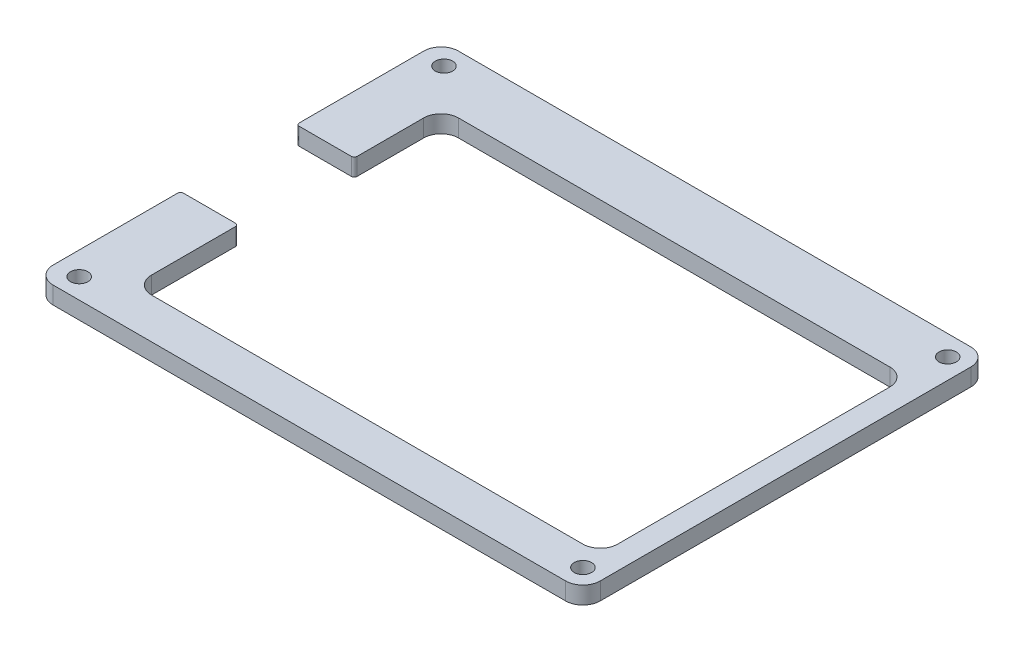
ISO-10303-21;
HEADER;
FILE_DESCRIPTION(('STEP AP214'),'2;1');
FILE_NAME('part.step','',(''),(''),'','','');
FILE_SCHEMA(('AUTOMOTIVE_DESIGN { 1 0 10303 214 1 1 1 1 }'));
ENDSEC;
DATA;
#1=APPLICATION_CONTEXT('core data for automotive mechanical design processes');
#2=APPLICATION_PROTOCOL_DEFINITION('international standard','automotive_design',2000,#1);
#3=PRODUCT_CONTEXT('',#1,'mechanical');
#4=PRODUCT('Part','Part','',(#3));
#5=PRODUCT_RELATED_PRODUCT_CATEGORY('part','',(#4));
#6=PRODUCT_DEFINITION_FORMATION('','',#4);
#7=PRODUCT_DEFINITION_CONTEXT('part definition',#1,'design');
#8=PRODUCT_DEFINITION('design','',#6,#7);
#9=PRODUCT_DEFINITION_SHAPE('','',#8);
#10=(LENGTH_UNIT() NAMED_UNIT(*) SI_UNIT(.MILLI.,.METRE.));
#11=(NAMED_UNIT(*) PLANE_ANGLE_UNIT() SI_UNIT($,.RADIAN.));
#12=(NAMED_UNIT(*) SI_UNIT($,.STERADIAN.) SOLID_ANGLE_UNIT());
#13=UNCERTAINTY_MEASURE_WITH_UNIT(LENGTH_MEASURE(1.E-05),#10,'distance_accuracy_value','');
#14=(GEOMETRIC_REPRESENTATION_CONTEXT(3) GLOBAL_UNCERTAINTY_ASSIGNED_CONTEXT((#13)) GLOBAL_UNIT_ASSIGNED_CONTEXT((#10,
#11,#12)) REPRESENTATION_CONTEXT('',''));
#15=CARTESIAN_POINT('',(0.,0.,0.));
#16=DIRECTION('',(0.,0.,1.));
#17=DIRECTION('',(1.,0.,0.));
#18=AXIS2_PLACEMENT_3D('',#15,#16,#17);
#19=CARTESIAN_POINT('',(-47.25,3.,-35.));
#20=DIRECTION('',(1.,0.,0.));
#21=DIRECTION('',(0.,0.,-1.));
#22=AXIS2_PLACEMENT_3D('',#19,#20,#21);
#23=PLANE('',#22);
#24=DIRECTION('',(0.,0.,1.));
#25=VECTOR('',#24,1.);
#26=CARTESIAN_POINT('',(-47.25,3.,-35.));
#27=LINE('',#26,#25);
#28=CARTESIAN_POINT('',(-47.25,3.,10.5));
#29=VERTEX_POINT('',#28);
#30=CARTESIAN_POINT('',(-47.25,3.,32.));
#31=VERTEX_POINT('',#30);
#32=EDGE_CURVE('E457',#29,#31,#27,.T.);
#33=ORIENTED_EDGE('',*,*,#32,.F.);
#34=DIRECTION('',(0.,1.,0.));
#35=VECTOR('',#34,1.);
#36=CARTESIAN_POINT('',(-47.25,3.,10.5));
#37=LINE('',#36,#35);
#38=CARTESIAN_POINT('',(-47.25,0.,10.5));
#39=VERTEX_POINT('',#38);
#40=EDGE_CURVE('E358',#29,#39,#37,.F.);
#41=ORIENTED_EDGE('',*,*,#40,.T.);
#42=DIRECTION('',(0.,0.,1.));
#43=VECTOR('',#42,1.);
#44=CARTESIAN_POINT('',(-47.25,0.,-35.));
#45=LINE('',#44,#43);
#46=CARTESIAN_POINT('',(-47.25,0.,32.));
#47=VERTEX_POINT('',#46);
#48=EDGE_CURVE('E242',#39,#47,#45,.T.);
#49=ORIENTED_EDGE('',*,*,#48,.T.);
#50=DIRECTION('',(0.,-1.,0.));
#51=VECTOR('',#50,1.);
#52=CARTESIAN_POINT('',(-47.25,3.,32.));
#53=LINE('',#52,#51);
#54=EDGE_CURVE('E211',#47,#31,#53,.F.);
#55=ORIENTED_EDGE('',*,*,#54,.T.);
#56=EDGE_LOOP('',(#33,#41,#49,#55));
#57=FACE_BOUND('',#56,.T.);
#58=ADVANCED_FACE('F39',(#57),#23,.F.);
#59=CARTESIAN_POINT('',(47.25,3.,-35.));
#60=DIRECTION('',(-1.,0.,0.));
#61=DIRECTION('',(0.,0.,1.));
#62=AXIS2_PLACEMENT_3D('',#59,#60,#61);
#63=PLANE('',#62);
#64=DIRECTION('',(0.,0.,-1.));
#65=VECTOR('',#64,1.);
#66=CARTESIAN_POINT('',(47.25,0.,-35.));
#67=LINE('',#66,#65);
#68=CARTESIAN_POINT('',(47.25,0.,32.));
#69=VERTEX_POINT('',#68);
#70=CARTESIAN_POINT('',(47.25,0.,-32.));
#71=VERTEX_POINT('',#70);
#72=EDGE_CURVE('E450',#69,#71,#67,.T.);
#73=ORIENTED_EDGE('',*,*,#72,.T.);
#74=DIRECTION('',(0.,-1.,0.));
#75=VECTOR('',#74,1.);
#76=CARTESIAN_POINT('',(47.25,3.,-32.));
#77=LINE('',#76,#75);
#78=CARTESIAN_POINT('',(47.25,3.,-32.));
#79=VERTEX_POINT('',#78);
#80=EDGE_CURVE('E283',#71,#79,#77,.F.);
#81=ORIENTED_EDGE('',*,*,#80,.T.);
#82=DIRECTION('',(0.,0.,-1.));
#83=VECTOR('',#82,1.);
#84=CARTESIAN_POINT('',(47.25,3.,-35.));
#85=LINE('',#84,#83);
#86=CARTESIAN_POINT('',(47.25,3.,32.));
#87=VERTEX_POINT('',#86);
#88=EDGE_CURVE('E234',#87,#79,#85,.T.);
#89=ORIENTED_EDGE('',*,*,#88,.F.);
#90=DIRECTION('',(0.,-1.,0.));
#91=VECTOR('',#90,1.);
#92=CARTESIAN_POINT('',(47.25,3.,32.));
#93=LINE('',#92,#91);
#94=EDGE_CURVE('E279',#87,#69,#93,.T.);
#95=ORIENTED_EDGE('',*,*,#94,.T.);
#96=EDGE_LOOP('',(#73,#81,#89,#95));
#97=FACE_BOUND('',#96,.T.);
#98=ADVANCED_FACE('F536',(#97),#63,.F.);
#99=CARTESIAN_POINT('',(-47.25,3.,-35.));
#100=DIRECTION('',(0.,0.,1.));
#101=DIRECTION('',(1.,0.,0.));
#102=AXIS2_PLACEMENT_3D('',#99,#100,#101);
#103=PLANE('',#102);
#104=DIRECTION('',(-1.,0.,0.));
#105=VECTOR('',#104,1.);
#106=CARTESIAN_POINT('',(-47.25,0.,-35.));
#107=LINE('',#106,#105);
#108=CARTESIAN_POINT('',(44.25,0.,-35.));
#109=VERTEX_POINT('',#108);
#110=CARTESIAN_POINT('',(-44.25,0.,-35.));
#111=VERTEX_POINT('',#110);
#112=EDGE_CURVE('E465',#109,#111,#107,.T.);
#113=ORIENTED_EDGE('',*,*,#112,.T.);
#114=DIRECTION('',(0.,-1.,0.));
#115=VECTOR('',#114,1.);
#116=CARTESIAN_POINT('',(-44.25,3.,-35.));
#117=LINE('',#116,#115);
#118=CARTESIAN_POINT('',(-44.25,3.,-35.));
#119=VERTEX_POINT('',#118);
#120=EDGE_CURVE('E276',#111,#119,#117,.F.);
#121=ORIENTED_EDGE('',*,*,#120,.T.);
#122=DIRECTION('',(-1.,0.,0.));
#123=VECTOR('',#122,1.);
#124=CARTESIAN_POINT('',(-47.25,3.,-35.));
#125=LINE('',#124,#123);
#126=CARTESIAN_POINT('',(44.25,3.,-35.));
#127=VERTEX_POINT('',#126);
#128=EDGE_CURVE('E240',#127,#119,#125,.T.);
#129=ORIENTED_EDGE('',*,*,#128,.F.);
#130=DIRECTION('',(0.,-1.,0.));
#131=VECTOR('',#130,1.);
#132=CARTESIAN_POINT('',(44.25,3.,-35.));
#133=LINE('',#132,#131);
#134=EDGE_CURVE('E272',#127,#109,#133,.T.);
#135=ORIENTED_EDGE('',*,*,#134,.T.);
#136=EDGE_LOOP('',(#113,#121,#129,#135));
#137=FACE_BOUND('',#136,.T.);
#138=ADVANCED_FACE('F542',(#137),#103,.F.);
#139=CARTESIAN_POINT('',(-47.25,0.,-32.));
#140=VERTEX_POINT('',#139);
#141=CARTESIAN_POINT('',(-47.25,0.,-10.5));
#142=VERTEX_POINT('',#141);
#143=EDGE_CURVE('E235',#140,#142,#45,.T.);
#144=ORIENTED_EDGE('',*,*,#143,.T.);
#145=DIRECTION('',(0.,1.,0.));
#146=VECTOR('',#145,1.);
#147=CARTESIAN_POINT('',(-47.25,3.,-10.5));
#148=LINE('',#147,#146);
#149=CARTESIAN_POINT('',(-47.25,3.,-10.5));
#150=VERTEX_POINT('',#149);
#151=EDGE_CURVE('E11',#142,#150,#148,.T.);
#152=ORIENTED_EDGE('',*,*,#151,.T.);
#153=CARTESIAN_POINT('',(-47.25,3.,-32.));
#154=VERTEX_POINT('',#153);
#155=EDGE_CURVE('E458',#154,#150,#27,.T.);
#156=ORIENTED_EDGE('',*,*,#155,.F.);
#157=DIRECTION('',(0.,-1.,0.));
#158=VECTOR('',#157,1.);
#159=CARTESIAN_POINT('',(-47.25,3.,-32.));
#160=LINE('',#159,#158);
#161=EDGE_CURVE('E215',#154,#140,#160,.T.);
#162=ORIENTED_EDGE('',*,*,#161,.T.);
#163=EDGE_LOOP('',(#144,#152,#156,#162));
#164=FACE_BOUND('',#163,.T.);
#165=ADVANCED_FACE('F538',(#164),#23,.F.);
#166=CARTESIAN_POINT('',(-47.25,3.,35.));
#167=DIRECTION('',(0.,0.,-1.));
#168=DIRECTION('',(-1.,0.,0.));
#169=AXIS2_PLACEMENT_3D('',#166,#167,#168);
#170=PLANE('',#169);
#171=DIRECTION('',(1.,0.,0.));
#172=VECTOR('',#171,1.);
#173=CARTESIAN_POINT('',(-47.25,3.,35.));
#174=LINE('',#173,#172);
#175=CARTESIAN_POINT('',(-44.25,3.,35.));
#176=VERTEX_POINT('',#175);
#177=CARTESIAN_POINT('',(44.25,3.,35.));
#178=VERTEX_POINT('',#177);
#179=EDGE_CURVE('E225',#176,#178,#174,.T.);
#180=ORIENTED_EDGE('',*,*,#179,.F.);
#181=DIRECTION('',(0.,-1.,0.));
#182=VECTOR('',#181,1.);
#183=CARTESIAN_POINT('',(-44.25,3.,35.));
#184=LINE('',#183,#182);
#185=CARTESIAN_POINT('',(-44.25,0.,35.));
#186=VERTEX_POINT('',#185);
#187=EDGE_CURVE('E209',#176,#186,#184,.T.);
#188=ORIENTED_EDGE('',*,*,#187,.T.);
#189=DIRECTION('',(1.,0.,0.));
#190=VECTOR('',#189,1.);
#191=CARTESIAN_POINT('',(-47.25,0.,35.));
#192=LINE('',#191,#190);
#193=CARTESIAN_POINT('',(44.25,0.,35.));
#194=VERTEX_POINT('',#193);
#195=EDGE_CURVE('E222',#186,#194,#192,.T.);
#196=ORIENTED_EDGE('',*,*,#195,.T.);
#197=DIRECTION('',(0.,-1.,0.));
#198=VECTOR('',#197,1.);
#199=CARTESIAN_POINT('',(44.25,3.,35.));
#200=LINE('',#199,#198);
#201=EDGE_CURVE('E228',#194,#178,#200,.F.);
#202=ORIENTED_EDGE('',*,*,#201,.T.);
#203=EDGE_LOOP('',(#180,#188,#196,#202));
#204=FACE_BOUND('',#203,.T.);
#205=ADVANCED_FACE('F221',(#204),#170,.F.);
#206=CARTESIAN_POINT('',(0.,3.,0.));
#207=DIRECTION('',(0.,1.,0.));
#208=DIRECTION('',(0.,0.,1.));
#209=AXIS2_PLACEMENT_3D('',#206,#207,#208);
#210=PLANE('',#209);
#211=DIRECTION('',(1.,0.,0.));
#212=VECTOR('',#211,1.);
#213=CARTESIAN_POINT('',(0.,3.,10.));
#214=LINE('',#213,#212);
#215=CARTESIAN_POINT('',(-46.75,3.,10.));
#216=VERTEX_POINT('',#215);
#217=CARTESIAN_POINT('',(-37.75,3.,10.));
#218=VERTEX_POINT('',#217);
#219=EDGE_CURVE('E410',#216,#218,#214,.T.);
#220=ORIENTED_EDGE('',*,*,#219,.F.);
#221=CARTESIAN_POINT('',(-46.75,3.,10.5));
#222=DIRECTION('',(0.,1.,0.));
#223=DIRECTION('',(0.,0.,1.));
#224=AXIS2_PLACEMENT_3D('',#221,#222,#223);
#225=CIRCLE('',#224,0.5);
#226=EDGE_CURVE('E355',#216,#29,#225,.T.);
#227=ORIENTED_EDGE('',*,*,#226,.T.);
#228=ORIENTED_EDGE('',*,*,#32,.T.);
#229=CARTESIAN_POINT('',(-44.25,3.,32.));
#230=DIRECTION('',(0.,1.,0.));
#231=DIRECTION('',(0.,0.,1.));
#232=AXIS2_PLACEMENT_3D('',#229,#230,#231);
#233=CIRCLE('',#232,3.);
#234=EDGE_CURVE('E269',#31,#176,#233,.T.);
#235=ORIENTED_EDGE('',*,*,#234,.T.);
#236=ORIENTED_EDGE('',*,*,#179,.T.);
#237=CARTESIAN_POINT('',(44.25,3.,32.));
#238=DIRECTION('',(0.,1.,0.));
#239=DIRECTION('',(0.,0.,1.));
#240=AXIS2_PLACEMENT_3D('',#237,#238,#239);
#241=CIRCLE('',#240,3.);
#242=EDGE_CURVE('E260',#178,#87,#241,.T.);
#243=ORIENTED_EDGE('',*,*,#242,.T.);
#244=ORIENTED_EDGE('',*,*,#88,.T.);
#245=CARTESIAN_POINT('',(44.25,3.,-32.));
#246=DIRECTION('',(0.,1.,0.));
#247=DIRECTION('',(0.,0.,1.));
#248=AXIS2_PLACEMENT_3D('',#245,#246,#247);
#249=CIRCLE('',#248,3.);
#250=EDGE_CURVE('E263',#79,#127,#249,.T.);
#251=ORIENTED_EDGE('',*,*,#250,.T.);
#252=ORIENTED_EDGE('',*,*,#128,.T.);
#253=CARTESIAN_POINT('',(-44.25,3.,-32.));
#254=DIRECTION('',(0.,1.,0.));
#255=DIRECTION('',(0.,0.,1.));
#256=AXIS2_PLACEMENT_3D('',#253,#254,#255);
#257=CIRCLE('',#256,3.);
#258=EDGE_CURVE('E266',#119,#154,#257,.T.);
#259=ORIENTED_EDGE('',*,*,#258,.T.);
#260=ORIENTED_EDGE('',*,*,#155,.T.);
#261=CARTESIAN_POINT('',(-46.75,3.,-10.5));
#262=DIRECTION('',(0.,1.,0.));
#263=DIRECTION('',(0.,0.,1.));
#264=AXIS2_PLACEMENT_3D('',#261,#262,#263);
#265=CIRCLE('',#264,0.5);
#266=CARTESIAN_POINT('',(-46.75,3.,-9.99999999999999));
#267=VERTEX_POINT('',#266);
#268=EDGE_CURVE('E346',#150,#267,#265,.T.);
#269=ORIENTED_EDGE('',*,*,#268,.T.);
#270=DIRECTION('',(-1.,0.,0.));
#271=VECTOR('',#270,1.);
#272=CARTESIAN_POINT('',(0.,3.,-9.99999999999999));
#273=LINE('',#272,#271);
#274=CARTESIAN_POINT('',(-37.75,3.,-9.99999999999999));
#275=VERTEX_POINT('',#274);
#276=EDGE_CURVE('E403',#275,#267,#273,.T.);
#277=ORIENTED_EDGE('',*,*,#276,.F.);
#278=CARTESIAN_POINT('',(-37.75,3.,-10.5));
#279=DIRECTION('',(0.,1.,0.));
#280=DIRECTION('',(0.,0.,1.));
#281=AXIS2_PLACEMENT_3D('',#278,#279,#280);
#282=CIRCLE('',#281,0.5);
#283=CARTESIAN_POINT('',(-37.25,3.,-10.5));
#284=VERTEX_POINT('',#283);
#285=EDGE_CURVE('E349',#275,#284,#282,.T.);
#286=ORIENTED_EDGE('',*,*,#285,.T.);
#287=DIRECTION('',(0.,0.,-1.));
#288=VECTOR('',#287,1.);
#289=CARTESIAN_POINT('',(-37.25,3.,0.));
#290=LINE('',#289,#288);
#291=CARTESIAN_POINT('',(-37.25,3.,-22.));
#292=VERTEX_POINT('',#291);
#293=EDGE_CURVE('E388',#284,#292,#290,.T.);
#294=ORIENTED_EDGE('',*,*,#293,.T.);
#295=CARTESIAN_POINT('',(-34.25,3.,-22.));
#296=DIRECTION('',(0.,1.,0.));
#297=DIRECTION('',(0.,0.,1.));
#298=AXIS2_PLACEMENT_3D('',#295,#296,#297);
#299=CIRCLE('',#298,3.);
#300=CARTESIAN_POINT('',(-34.25,3.,-25.));
#301=VERTEX_POINT('',#300);
#302=EDGE_CURVE('E332',#292,#301,#299,.F.);
#303=ORIENTED_EDGE('',*,*,#302,.T.);
#304=DIRECTION('',(1.,0.,0.));
#305=VECTOR('',#304,1.);
#306=CARTESIAN_POINT('',(0.,3.,-25.));
#307=LINE('',#306,#305);
#308=CARTESIAN_POINT('',(40.25,3.,-25.));
#309=VERTEX_POINT('',#308);
#310=EDGE_CURVE('E417',#301,#309,#307,.T.);
#311=ORIENTED_EDGE('',*,*,#310,.T.);
#312=CARTESIAN_POINT('',(40.25,3.,-22.));
#313=DIRECTION('',(0.,1.,0.));
#314=DIRECTION('',(0.,0.,1.));
#315=AXIS2_PLACEMENT_3D('',#312,#313,#314);
#316=CIRCLE('',#315,3.);
#317=CARTESIAN_POINT('',(43.25,3.,-22.));
#318=VERTEX_POINT('',#317);
#319=EDGE_CURVE('E320',#309,#318,#316,.F.);
#320=ORIENTED_EDGE('',*,*,#319,.T.);
#321=DIRECTION('',(0.,0.,1.));
#322=VECTOR('',#321,1.);
#323=CARTESIAN_POINT('',(43.25,3.,0.));
#324=LINE('',#323,#322);
#325=CARTESIAN_POINT('',(43.25,3.,24.9999999999999));
#326=VERTEX_POINT('',#325);
#327=EDGE_CURVE('E509',#318,#326,#324,.T.);
#328=ORIENTED_EDGE('',*,*,#327,.T.);
#329=CARTESIAN_POINT('',(40.25,3.,24.9999999999999));
#330=DIRECTION('',(0.,1.,0.));
#331=DIRECTION('',(0.,0.,1.));
#332=AXIS2_PLACEMENT_3D('',#329,#330,#331);
#333=CIRCLE('',#332,3.);
#334=CARTESIAN_POINT('',(40.25,3.,27.9999999999999));
#335=VERTEX_POINT('',#334);
#336=EDGE_CURVE('E314',#326,#335,#333,.F.);
#337=ORIENTED_EDGE('',*,*,#336,.T.);
#338=DIRECTION('',(-1.,0.,0.));
#339=VECTOR('',#338,1.);
#340=CARTESIAN_POINT('',(0.,3.,27.9999999999999));
#341=LINE('',#340,#339);
#342=CARTESIAN_POINT('',(-34.25,3.,28.));
#343=VERTEX_POINT('',#342);
#344=EDGE_CURVE('E505',#335,#343,#341,.T.);
#345=ORIENTED_EDGE('',*,*,#344,.T.);
#346=CARTESIAN_POINT('',(-34.25,3.,25.));
#347=DIRECTION('',(0.,1.,0.));
#348=DIRECTION('',(0.,0.,1.));
#349=AXIS2_PLACEMENT_3D('',#346,#347,#348);
#350=CIRCLE('',#349,3.);
#351=CARTESIAN_POINT('',(-37.25,3.,25.));
#352=VERTEX_POINT('',#351);
#353=EDGE_CURVE('E326',#343,#352,#350,.F.);
#354=ORIENTED_EDGE('',*,*,#353,.T.);
#355=CARTESIAN_POINT('',(-37.25,3.,10.5));
#356=VERTEX_POINT('',#355);
#357=EDGE_CURVE('E415',#352,#356,#290,.T.);
#358=ORIENTED_EDGE('',*,*,#357,.T.);
#359=CARTESIAN_POINT('',(-37.75,3.,10.5));
#360=DIRECTION('',(0.,1.,0.));
#361=DIRECTION('',(0.,0.,1.));
#362=AXIS2_PLACEMENT_3D('',#359,#360,#361);
#363=CIRCLE('',#362,0.5);
#364=EDGE_CURVE('E352',#356,#218,#363,.T.);
#365=ORIENTED_EDGE('',*,*,#364,.T.);
#366=EDGE_LOOP('',(#220,#227,#228,#235,#236,#243,#244,#251,#252,#259,#260,#269,#277,#286,#294,
#303,#311,#320,#328,#337,#345,#354,#358,#365));
#367=FACE_BOUND('',#366,.T.);
#368=CARTESIAN_POINT('',(43.75,3.,31.5));
#369=DIRECTION('',(0.,1.,0.));
#370=DIRECTION('',(0.,0.,1.));
#371=AXIS2_PLACEMENT_3D('',#368,#369,#370);
#372=CIRCLE('',#371,1.5);
#373=CARTESIAN_POINT('',(43.75,3.,33.));
#374=VERTEX_POINT('',#373);
#375=EDGE_CURVE('E442',#374,#374,#372,.T.);
#376=ORIENTED_EDGE('',*,*,#375,.F.);
#377=EDGE_LOOP('',(#376));
#378=FACE_BOUND('',#377,.T.);
#379=CARTESIAN_POINT('',(-43.25,3.,31.5));
#380=DIRECTION('',(0.,1.,0.));
#381=DIRECTION('',(0.,0.,1.));
#382=AXIS2_PLACEMENT_3D('',#379,#380,#381);
#383=CIRCLE('',#382,1.5);
#384=CARTESIAN_POINT('',(-43.25,3.,33.));
#385=VERTEX_POINT('',#384);
#386=EDGE_CURVE('E434',#385,#385,#383,.T.);
#387=ORIENTED_EDGE('',*,*,#386,.F.);
#388=EDGE_LOOP('',(#387));
#389=FACE_BOUND('',#388,.T.);
#390=CARTESIAN_POINT('',(-43.25,3.,-31.5));
#391=DIRECTION('',(0.,1.,0.));
#392=DIRECTION('',(0.,0.,1.));
#393=AXIS2_PLACEMENT_3D('',#390,#391,#392);
#394=CIRCLE('',#393,1.5);
#395=CARTESIAN_POINT('',(-43.25,3.,-30.));
#396=VERTEX_POINT('',#395);
#397=EDGE_CURVE('E426',#396,#396,#394,.T.);
#398=ORIENTED_EDGE('',*,*,#397,.F.);
#399=EDGE_LOOP('',(#398));
#400=FACE_BOUND('',#399,.T.);
#401=CARTESIAN_POINT('',(43.75,3.,-31.5));
#402=DIRECTION('',(0.,1.,0.));
#403=DIRECTION('',(0.,0.,1.));
#404=AXIS2_PLACEMENT_3D('',#401,#402,#403);
#405=CIRCLE('',#404,1.5);
#406=CARTESIAN_POINT('',(43.75,3.,-30.));
#407=VERTEX_POINT('',#406);
#408=EDGE_CURVE('E425',#407,#407,#405,.T.);
#409=ORIENTED_EDGE('',*,*,#408,.F.);
#410=EDGE_LOOP('',(#409));
#411=FACE_BOUND('',#410,.T.);
#412=ADVANCED_FACE('F406',(#367,#378,#389,#400,#411),#210,.T.);
#413=CARTESIAN_POINT('',(0.,0.,0.));
#414=DIRECTION('',(0.,1.,0.));
#415=DIRECTION('',(0.,0.,1.));
#416=AXIS2_PLACEMENT_3D('',#413,#414,#415);
#417=PLANE('',#416);
#418=ORIENTED_EDGE('',*,*,#48,.F.);
#419=CARTESIAN_POINT('',(-46.75,0.,10.5));
#420=DIRECTION('',(0.,1.,0.));
#421=DIRECTION('',(0.,0.,1.));
#422=AXIS2_PLACEMENT_3D('',#419,#420,#421);
#423=CIRCLE('',#422,0.5);
#424=CARTESIAN_POINT('',(-46.75,0.,10.));
#425=VERTEX_POINT('',#424);
#426=EDGE_CURVE('E369',#39,#425,#423,.F.);
#427=ORIENTED_EDGE('',*,*,#426,.T.);
#428=DIRECTION('',(1.,0.,0.));
#429=VECTOR('',#428,1.);
#430=CARTESIAN_POINT('',(0.,0.,10.));
#431=LINE('',#430,#429);
#432=CARTESIAN_POINT('',(-37.75,0.,10.));
#433=VERTEX_POINT('',#432);
#434=EDGE_CURVE('E484',#425,#433,#431,.T.);
#435=ORIENTED_EDGE('',*,*,#434,.T.);
#436=CARTESIAN_POINT('',(-37.75,0.,10.5));
#437=DIRECTION('',(0.,1.,0.));
#438=DIRECTION('',(0.,0.,1.));
#439=AXIS2_PLACEMENT_3D('',#436,#437,#438);
#440=CIRCLE('',#439,0.5);
#441=CARTESIAN_POINT('',(-37.25,0.,10.5));
#442=VERTEX_POINT('',#441);
#443=EDGE_CURVE('E366',#433,#442,#440,.F.);
#444=ORIENTED_EDGE('',*,*,#443,.T.);
#445=DIRECTION('',(0.,0.,-1.));
#446=VECTOR('',#445,1.);
#447=CARTESIAN_POINT('',(-37.25,0.,0.));
#448=LINE('',#447,#446);
#449=CARTESIAN_POINT('',(-37.25,0.,25.));
#450=VERTEX_POINT('',#449);
#451=EDGE_CURVE('E398',#450,#442,#448,.T.);
#452=ORIENTED_EDGE('',*,*,#451,.F.);
#453=CARTESIAN_POINT('',(-34.25,0.,25.));
#454=DIRECTION('',(0.,1.,0.));
#455=DIRECTION('',(0.,0.,1.));
#456=AXIS2_PLACEMENT_3D('',#453,#454,#455);
#457=CIRCLE('',#456,3.);
#458=CARTESIAN_POINT('',(-34.25,0.,28.));
#459=VERTEX_POINT('',#458);
#460=EDGE_CURVE('E329',#450,#459,#457,.T.);
#461=ORIENTED_EDGE('',*,*,#460,.T.);
#462=DIRECTION('',(-1.,0.,0.));
#463=VECTOR('',#462,1.);
#464=CARTESIAN_POINT('',(0.,0.,27.9999999999999));
#465=LINE('',#464,#463);
#466=CARTESIAN_POINT('',(40.25,0.,27.9999999999999));
#467=VERTEX_POINT('',#466);
#468=EDGE_CURVE('E824',#467,#459,#465,.T.);
#469=ORIENTED_EDGE('',*,*,#468,.F.);
#470=CARTESIAN_POINT('',(40.25,0.,24.9999999999999));
#471=DIRECTION('',(0.,1.,0.));
#472=DIRECTION('',(0.,0.,1.));
#473=AXIS2_PLACEMENT_3D('',#470,#471,#472);
#474=CIRCLE('',#473,3.);
#475=CARTESIAN_POINT('',(43.25,0.,24.9999999999999));
#476=VERTEX_POINT('',#475);
#477=EDGE_CURVE('E317',#467,#476,#474,.T.);
#478=ORIENTED_EDGE('',*,*,#477,.T.);
#479=DIRECTION('',(0.,0.,1.));
#480=VECTOR('',#479,1.);
#481=CARTESIAN_POINT('',(43.25,0.,0.));
#482=LINE('',#481,#480);
#483=CARTESIAN_POINT('',(43.25,0.,-22.));
#484=VERTEX_POINT('',#483);
#485=EDGE_CURVE('E822',#484,#476,#482,.T.);
#486=ORIENTED_EDGE('',*,*,#485,.F.);
#487=CARTESIAN_POINT('',(40.25,0.,-22.));
#488=DIRECTION('',(0.,1.,0.));
#489=DIRECTION('',(0.,0.,1.));
#490=AXIS2_PLACEMENT_3D('',#487,#488,#489);
#491=CIRCLE('',#490,3.);
#492=CARTESIAN_POINT('',(40.25,0.,-25.));
#493=VERTEX_POINT('',#492);
#494=EDGE_CURVE('E323',#484,#493,#491,.T.);
#495=ORIENTED_EDGE('',*,*,#494,.T.);
#496=DIRECTION('',(1.,0.,0.));
#497=VECTOR('',#496,1.);
#498=CARTESIAN_POINT('',(0.,0.,-25.));
#499=LINE('',#498,#497);
#500=CARTESIAN_POINT('',(-34.25,0.,-25.));
#501=VERTEX_POINT('',#500);
#502=EDGE_CURVE('E396',#501,#493,#499,.T.);
#503=ORIENTED_EDGE('',*,*,#502,.F.);
#504=CARTESIAN_POINT('',(-34.25,0.,-22.));
#505=DIRECTION('',(0.,1.,0.));
#506=DIRECTION('',(0.,0.,1.));
#507=AXIS2_PLACEMENT_3D('',#504,#505,#506);
#508=CIRCLE('',#507,3.);
#509=CARTESIAN_POINT('',(-37.25,0.,-22.));
#510=VERTEX_POINT('',#509);
#511=EDGE_CURVE('E335',#501,#510,#508,.T.);
#512=ORIENTED_EDGE('',*,*,#511,.T.);
#513=CARTESIAN_POINT('',(-37.25,0.,-10.5));
#514=VERTEX_POINT('',#513);
#515=EDGE_CURVE('E387',#514,#510,#448,.T.);
#516=ORIENTED_EDGE('',*,*,#515,.F.);
#517=CARTESIAN_POINT('',(-37.75,0.,-10.5));
#518=DIRECTION('',(0.,1.,0.));
#519=DIRECTION('',(0.,0.,1.));
#520=AXIS2_PLACEMENT_3D('',#517,#518,#519);
#521=CIRCLE('',#520,0.5);
#522=CARTESIAN_POINT('',(-37.75,0.,-9.99999999999999));
#523=VERTEX_POINT('',#522);
#524=EDGE_CURVE('E363',#514,#523,#521,.F.);
#525=ORIENTED_EDGE('',*,*,#524,.T.);
#526=DIRECTION('',(-1.,0.,0.));
#527=VECTOR('',#526,1.);
#528=CARTESIAN_POINT('',(0.,0.,-9.99999999999999));
#529=LINE('',#528,#527);
#530=CARTESIAN_POINT('',(-46.75,0.,-9.99999999999999));
#531=VERTEX_POINT('',#530);
#532=EDGE_CURVE('E395',#523,#531,#529,.T.);
#533=ORIENTED_EDGE('',*,*,#532,.T.);
#534=CARTESIAN_POINT('',(-46.75,0.,-10.5));
#535=DIRECTION('',(0.,1.,0.));
#536=DIRECTION('',(0.,0.,1.));
#537=AXIS2_PLACEMENT_3D('',#534,#535,#536);
#538=CIRCLE('',#537,0.5);
#539=EDGE_CURVE('E55',#531,#142,#538,.F.);
#540=ORIENTED_EDGE('',*,*,#539,.T.);
#541=ORIENTED_EDGE('',*,*,#143,.F.);
#542=CARTESIAN_POINT('',(-44.25,0.,-32.));
#543=DIRECTION('',(0.,1.,0.));
#544=DIRECTION('',(0.,0.,1.));
#545=AXIS2_PLACEMENT_3D('',#542,#543,#544);
#546=CIRCLE('',#545,3.);
#547=EDGE_CURVE('E216',#140,#111,#546,.F.);
#548=ORIENTED_EDGE('',*,*,#547,.T.);
#549=ORIENTED_EDGE('',*,*,#112,.F.);
#550=CARTESIAN_POINT('',(44.25,0.,-32.));
#551=DIRECTION('',(0.,1.,0.));
#552=DIRECTION('',(0.,0.,1.));
#553=AXIS2_PLACEMENT_3D('',#550,#551,#552);
#554=CIRCLE('',#553,3.);
#555=EDGE_CURVE('E250',#109,#71,#554,.F.);
#556=ORIENTED_EDGE('',*,*,#555,.T.);
#557=ORIENTED_EDGE('',*,*,#72,.F.);
#558=CARTESIAN_POINT('',(44.25,0.,32.));
#559=DIRECTION('',(0.,1.,0.));
#560=DIRECTION('',(0.,0.,1.));
#561=AXIS2_PLACEMENT_3D('',#558,#559,#560);
#562=CIRCLE('',#561,3.);
#563=EDGE_CURVE('E227',#69,#194,#562,.F.);
#564=ORIENTED_EDGE('',*,*,#563,.T.);
#565=ORIENTED_EDGE('',*,*,#195,.F.);
#566=CARTESIAN_POINT('',(-44.25,0.,32.));
#567=DIRECTION('',(0.,1.,0.));
#568=DIRECTION('',(0.,0.,1.));
#569=AXIS2_PLACEMENT_3D('',#566,#567,#568);
#570=CIRCLE('',#569,3.);
#571=EDGE_CURVE('E205',#186,#47,#570,.F.);
#572=ORIENTED_EDGE('',*,*,#571,.T.);
#573=EDGE_LOOP('',(#418,#427,#435,#444,#452,#461,#469,#478,#486,#495,#503,#512,#516,#525,#533,
#540,#541,#548,#549,#556,#557,#564,#565,#572));
#574=FACE_BOUND('',#573,.T.);
#575=CARTESIAN_POINT('',(43.75,0.,31.5));
#576=DIRECTION('',(0.,1.,0.));
#577=DIRECTION('',(0.,0.,1.));
#578=AXIS2_PLACEMENT_3D('',#575,#576,#577);
#579=CIRCLE('',#578,1.5);
#580=CARTESIAN_POINT('',(43.75,0.,33.));
#581=VERTEX_POINT('',#580);
#582=EDGE_CURVE('E438',#581,#581,#579,.T.);
#583=ORIENTED_EDGE('',*,*,#582,.T.);
#584=EDGE_LOOP('',(#583));
#585=FACE_BOUND('',#584,.T.);
#586=CARTESIAN_POINT('',(-43.25,0.,31.5));
#587=DIRECTION('',(0.,1.,0.));
#588=DIRECTION('',(0.,0.,1.));
#589=AXIS2_PLACEMENT_3D('',#586,#587,#588);
#590=CIRCLE('',#589,1.5);
#591=CARTESIAN_POINT('',(-43.25,0.,33.));
#592=VERTEX_POINT('',#591);
#593=EDGE_CURVE('E430',#592,#592,#590,.T.);
#594=ORIENTED_EDGE('',*,*,#593,.T.);
#595=EDGE_LOOP('',(#594));
#596=FACE_BOUND('',#595,.T.);
#597=CARTESIAN_POINT('',(-43.25,0.,-31.5));
#598=DIRECTION('',(0.,1.,0.));
#599=DIRECTION('',(0.,0.,1.));
#600=AXIS2_PLACEMENT_3D('',#597,#598,#599);
#601=CIRCLE('',#600,1.5);
#602=CARTESIAN_POINT('',(-43.25,0.,-30.));
#603=VERTEX_POINT('',#602);
#604=EDGE_CURVE('E421',#603,#603,#601,.T.);
#605=ORIENTED_EDGE('',*,*,#604,.T.);
#606=EDGE_LOOP('',(#605));
#607=FACE_BOUND('',#606,.T.);
#608=CARTESIAN_POINT('',(43.75,0.,-31.5));
#609=DIRECTION('',(0.,1.,0.));
#610=DIRECTION('',(0.,0.,1.));
#611=AXIS2_PLACEMENT_3D('',#608,#609,#610);
#612=CIRCLE('',#611,1.5);
#613=CARTESIAN_POINT('',(43.75,0.,-30.));
#614=VERTEX_POINT('',#613);
#615=EDGE_CURVE('E446',#614,#614,#612,.T.);
#616=ORIENTED_EDGE('',*,*,#615,.T.);
#617=EDGE_LOOP('',(#616));
#618=FACE_BOUND('',#617,.T.);
#619=ADVANCED_FACE('F230',(#574,#585,#596,#607,#618),#417,.F.);
#620=CARTESIAN_POINT('',(43.75,0.,-31.5));
#621=DIRECTION('',(0.,1.,0.));
#622=DIRECTION('',(0.,0.,1.));
#623=AXIS2_PLACEMENT_3D('',#620,#621,#622);
#624=CYLINDRICAL_SURFACE('',#623,1.5);
#625=ORIENTED_EDGE('',*,*,#615,.F.);
#626=EDGE_LOOP('',(#625));
#627=FACE_BOUND('',#626,.T.);
#628=ORIENTED_EDGE('',*,*,#408,.T.);
#629=EDGE_LOOP('',(#628));
#630=FACE_BOUND('',#629,.T.);
#631=ADVANCED_FACE('F617',(#627,#630),#624,.F.);
#632=CARTESIAN_POINT('',(-43.25,0.,-31.5));
#633=DIRECTION('',(0.,1.,0.));
#634=DIRECTION('',(0.,0.,1.));
#635=AXIS2_PLACEMENT_3D('',#632,#633,#634);
#636=CYLINDRICAL_SURFACE('',#635,1.5);
#637=ORIENTED_EDGE('',*,*,#604,.F.);
#638=EDGE_LOOP('',(#637));
#639=FACE_BOUND('',#638,.T.);
#640=ORIENTED_EDGE('',*,*,#397,.T.);
#641=EDGE_LOOP('',(#640));
#642=FACE_BOUND('',#641,.T.);
#643=ADVANCED_FACE('F763',(#639,#642),#636,.F.);
#644=CARTESIAN_POINT('',(-43.25,0.,31.5));
#645=DIRECTION('',(0.,1.,0.));
#646=DIRECTION('',(0.,0.,1.));
#647=AXIS2_PLACEMENT_3D('',#644,#645,#646);
#648=CYLINDRICAL_SURFACE('',#647,1.5);
#649=ORIENTED_EDGE('',*,*,#593,.F.);
#650=EDGE_LOOP('',(#649));
#651=FACE_BOUND('',#650,.T.);
#652=ORIENTED_EDGE('',*,*,#386,.T.);
#653=EDGE_LOOP('',(#652));
#654=FACE_BOUND('',#653,.T.);
#655=ADVANCED_FACE('F753',(#651,#654),#648,.F.);
#656=CARTESIAN_POINT('',(43.75,0.,31.5));
#657=DIRECTION('',(0.,1.,0.));
#658=DIRECTION('',(0.,0.,1.));
#659=AXIS2_PLACEMENT_3D('',#656,#657,#658);
#660=CYLINDRICAL_SURFACE('',#659,1.5);
#661=ORIENTED_EDGE('',*,*,#582,.F.);
#662=EDGE_LOOP('',(#661));
#663=FACE_BOUND('',#662,.T.);
#664=ORIENTED_EDGE('',*,*,#375,.T.);
#665=EDGE_LOOP('',(#664));
#666=FACE_BOUND('',#665,.T.);
#667=ADVANCED_FACE('F728',(#663,#666),#660,.F.);
#668=CARTESIAN_POINT('',(-44.25,3.,32.));
#669=DIRECTION('',(0.,-1.,0.));
#670=DIRECTION('',(0.,0.,-1.));
#671=AXIS2_PLACEMENT_3D('',#668,#669,#670);
#672=CYLINDRICAL_SURFACE('',#671,3.);
#673=ORIENTED_EDGE('',*,*,#234,.F.);
#674=ORIENTED_EDGE('',*,*,#54,.F.);
#675=ORIENTED_EDGE('',*,*,#571,.F.);
#676=ORIENTED_EDGE('',*,*,#187,.F.);
#677=EDGE_LOOP('',(#673,#674,#675,#676));
#678=FACE_BOUND('',#677,.T.);
#679=ADVANCED_FACE('F208',(#678),#672,.T.);
#680=CARTESIAN_POINT('',(-44.25,3.,-32.));
#681=DIRECTION('',(0.,-1.,0.));
#682=DIRECTION('',(0.,0.,-1.));
#683=AXIS2_PLACEMENT_3D('',#680,#681,#682);
#684=CYLINDRICAL_SURFACE('',#683,3.);
#685=ORIENTED_EDGE('',*,*,#258,.F.);
#686=ORIENTED_EDGE('',*,*,#120,.F.);
#687=ORIENTED_EDGE('',*,*,#547,.F.);
#688=ORIENTED_EDGE('',*,*,#161,.F.);
#689=EDGE_LOOP('',(#685,#686,#687,#688));
#690=FACE_BOUND('',#689,.T.);
#691=ADVANCED_FACE('F709',(#690),#684,.T.);
#692=CARTESIAN_POINT('',(44.25,3.,-32.));
#693=DIRECTION('',(0.,-1.,0.));
#694=DIRECTION('',(0.,0.,-1.));
#695=AXIS2_PLACEMENT_3D('',#692,#693,#694);
#696=CYLINDRICAL_SURFACE('',#695,3.);
#697=ORIENTED_EDGE('',*,*,#250,.F.);
#698=ORIENTED_EDGE('',*,*,#80,.F.);
#699=ORIENTED_EDGE('',*,*,#555,.F.);
#700=ORIENTED_EDGE('',*,*,#134,.F.);
#701=EDGE_LOOP('',(#697,#698,#699,#700));
#702=FACE_BOUND('',#701,.T.);
#703=ADVANCED_FACE('F699',(#702),#696,.T.);
#704=CARTESIAN_POINT('',(44.25,3.,32.));
#705=DIRECTION('',(0.,-1.,0.));
#706=DIRECTION('',(0.,0.,-1.));
#707=AXIS2_PLACEMENT_3D('',#704,#705,#706);
#708=CYLINDRICAL_SURFACE('',#707,3.);
#709=ORIENTED_EDGE('',*,*,#242,.F.);
#710=ORIENTED_EDGE('',*,*,#201,.F.);
#711=ORIENTED_EDGE('',*,*,#563,.F.);
#712=ORIENTED_EDGE('',*,*,#94,.F.);
#713=EDGE_LOOP('',(#709,#710,#711,#712));
#714=FACE_BOUND('',#713,.T.);
#715=ADVANCED_FACE('F690',(#714),#708,.T.);
#716=CARTESIAN_POINT('',(0.,0.,27.9999999999999));
#717=DIRECTION('',(0.,0.,-1.));
#718=DIRECTION('',(-1.,0.,0.));
#719=AXIS2_PLACEMENT_3D('',#716,#717,#718);
#720=PLANE('',#719);
#721=ORIENTED_EDGE('',*,*,#344,.F.);
#722=DIRECTION('',(0.,1.,0.));
#723=VECTOR('',#722,1.);
#724=CARTESIAN_POINT('',(40.25,0.,27.9999999999999));
#725=LINE('',#724,#723);
#726=EDGE_CURVE('E297',#335,#467,#725,.F.);
#727=ORIENTED_EDGE('',*,*,#726,.T.);
#728=ORIENTED_EDGE('',*,*,#468,.T.);
#729=DIRECTION('',(0.,1.,0.));
#730=VECTOR('',#729,1.);
#731=CARTESIAN_POINT('',(-34.25,3.,28.));
#732=LINE('',#731,#730);
#733=EDGE_CURVE('E293',#459,#343,#732,.T.);
#734=ORIENTED_EDGE('',*,*,#733,.T.);
#735=EDGE_LOOP('',(#721,#727,#728,#734));
#736=FACE_BOUND('',#735,.T.);
#737=ADVANCED_FACE('F607',(#736),#720,.T.);
#738=CARTESIAN_POINT('',(-37.25,0.,0.));
#739=DIRECTION('',(1.,0.,0.));
#740=DIRECTION('',(0.,0.,-1.));
#741=AXIS2_PLACEMENT_3D('',#738,#739,#740);
#742=PLANE('',#741);
#743=ORIENTED_EDGE('',*,*,#451,.T.);
#744=DIRECTION('',(0.,1.,0.));
#745=VECTOR('',#744,1.);
#746=CARTESIAN_POINT('',(-37.25,3.,10.5));
#747=LINE('',#746,#745);
#748=EDGE_CURVE('E372',#442,#356,#747,.T.);
#749=ORIENTED_EDGE('',*,*,#748,.T.);
#750=ORIENTED_EDGE('',*,*,#357,.F.);
#751=DIRECTION('',(0.,1.,0.));
#752=VECTOR('',#751,1.);
#753=CARTESIAN_POINT('',(-37.25,0.,25.));
#754=LINE('',#753,#752);
#755=EDGE_CURVE('E307',#352,#450,#754,.F.);
#756=ORIENTED_EDGE('',*,*,#755,.T.);
#757=EDGE_LOOP('',(#743,#749,#750,#756));
#758=FACE_BOUND('',#757,.T.);
#759=ADVANCED_FACE('F493',(#758),#742,.T.);
#760=CARTESIAN_POINT('',(0.,0.,10.));
#761=DIRECTION('',(0.,0.,1.));
#762=DIRECTION('',(1.,0.,0.));
#763=AXIS2_PLACEMENT_3D('',#760,#761,#762);
#764=PLANE('',#763);
#765=ORIENTED_EDGE('',*,*,#434,.F.);
#766=DIRECTION('',(0.,1.,0.));
#767=VECTOR('',#766,1.);
#768=CARTESIAN_POINT('',(-46.75,0.,10.));
#769=LINE('',#768,#767);
#770=EDGE_CURVE('E342',#425,#216,#769,.T.);
#771=ORIENTED_EDGE('',*,*,#770,.T.);
#772=ORIENTED_EDGE('',*,*,#219,.T.);
#773=DIRECTION('',(0.,1.,0.));
#774=VECTOR('',#773,1.);
#775=CARTESIAN_POINT('',(-37.75,0.,10.));
#776=LINE('',#775,#774);
#777=EDGE_CURVE('E339',#218,#433,#776,.F.);
#778=ORIENTED_EDGE('',*,*,#777,.T.);
#779=EDGE_LOOP('',(#765,#771,#772,#778));
#780=FACE_BOUND('',#779,.T.);
#781=ADVANCED_FACE('F482',(#780),#764,.F.);
#782=CARTESIAN_POINT('',(0.,0.,-9.99999999999999));
#783=DIRECTION('',(0.,0.,-1.));
#784=DIRECTION('',(-1.,0.,0.));
#785=AXIS2_PLACEMENT_3D('',#782,#783,#784);
#786=PLANE('',#785);
#787=ORIENTED_EDGE('',*,*,#532,.F.);
#788=DIRECTION('',(0.,1.,0.));
#789=VECTOR('',#788,1.);
#790=CARTESIAN_POINT('',(-37.75,3.,-9.99999999999999));
#791=LINE('',#790,#789);
#792=EDGE_CURVE('E378',#523,#275,#791,.T.);
#793=ORIENTED_EDGE('',*,*,#792,.T.);
#794=ORIENTED_EDGE('',*,*,#276,.T.);
#795=DIRECTION('',(0.,1.,0.));
#796=VECTOR('',#795,1.);
#797=CARTESIAN_POINT('',(-46.75,0.,-9.99999999999999));
#798=LINE('',#797,#796);
#799=EDGE_CURVE('E63',#267,#531,#798,.F.);
#800=ORIENTED_EDGE('',*,*,#799,.T.);
#801=EDGE_LOOP('',(#787,#793,#794,#800));
#802=FACE_BOUND('',#801,.T.);
#803=ADVANCED_FACE('F402',(#802),#786,.F.);
#804=ORIENTED_EDGE('',*,*,#293,.F.);
#805=DIRECTION('',(0.,1.,0.));
#806=VECTOR('',#805,1.);
#807=CARTESIAN_POINT('',(-37.25,0.,-10.5));
#808=LINE('',#807,#806);
#809=EDGE_CURVE('E48',#284,#514,#808,.F.);
#810=ORIENTED_EDGE('',*,*,#809,.T.);
#811=ORIENTED_EDGE('',*,*,#515,.T.);
#812=DIRECTION('',(0.,1.,0.));
#813=VECTOR('',#812,1.);
#814=CARTESIAN_POINT('',(-37.25,3.,-22.));
#815=LINE('',#814,#813);
#816=EDGE_CURVE('E310',#510,#292,#815,.T.);
#817=ORIENTED_EDGE('',*,*,#816,.T.);
#818=EDGE_LOOP('',(#804,#810,#811,#817));
#819=FACE_BOUND('',#818,.T.);
#820=ADVANCED_FACE('F386',(#819),#742,.T.);
#821=CARTESIAN_POINT('',(0.,0.,-25.));
#822=DIRECTION('',(0.,0.,1.));
#823=DIRECTION('',(1.,0.,0.));
#824=AXIS2_PLACEMENT_3D('',#821,#822,#823);
#825=PLANE('',#824);
#826=ORIENTED_EDGE('',*,*,#502,.T.);
#827=DIRECTION('',(0.,1.,0.));
#828=VECTOR('',#827,1.);
#829=CARTESIAN_POINT('',(40.25,3.,-25.));
#830=LINE('',#829,#828);
#831=EDGE_CURVE('E303',#493,#309,#830,.T.);
#832=ORIENTED_EDGE('',*,*,#831,.T.);
#833=ORIENTED_EDGE('',*,*,#310,.F.);
#834=DIRECTION('',(0.,1.,0.));
#835=VECTOR('',#834,1.);
#836=CARTESIAN_POINT('',(-34.25,0.,-25.));
#837=LINE('',#836,#835);
#838=EDGE_CURVE('E300',#301,#501,#837,.F.);
#839=ORIENTED_EDGE('',*,*,#838,.T.);
#840=EDGE_LOOP('',(#826,#832,#833,#839));
#841=FACE_BOUND('',#840,.T.);
#842=ADVANCED_FACE('F520',(#841),#825,.T.);
#843=CARTESIAN_POINT('',(43.25,0.,0.));
#844=DIRECTION('',(-1.,0.,0.));
#845=DIRECTION('',(0.,0.,1.));
#846=AXIS2_PLACEMENT_3D('',#843,#844,#845);
#847=PLANE('',#846);
#848=ORIENTED_EDGE('',*,*,#485,.T.);
#849=DIRECTION('',(0.,1.,0.));
#850=VECTOR('',#849,1.);
#851=CARTESIAN_POINT('',(43.25,3.,24.9999999999999));
#852=LINE('',#851,#850);
#853=EDGE_CURVE('E289',#476,#326,#852,.T.);
#854=ORIENTED_EDGE('',*,*,#853,.T.);
#855=ORIENTED_EDGE('',*,*,#327,.F.);
#856=DIRECTION('',(0.,1.,0.));
#857=VECTOR('',#856,1.);
#858=CARTESIAN_POINT('',(43.25,0.,-22.));
#859=LINE('',#858,#857);
#860=EDGE_CURVE('E286',#318,#484,#859,.F.);
#861=ORIENTED_EDGE('',*,*,#860,.T.);
#862=EDGE_LOOP('',(#848,#854,#855,#861));
#863=FACE_BOUND('',#862,.T.);
#864=ADVANCED_FACE('F667',(#863),#847,.T.);
#865=CARTESIAN_POINT('',(40.25,0.,24.9999999999999));
#866=DIRECTION('',(0.,-1.,0.));
#867=DIRECTION('',(0.,0.,-1.));
#868=AXIS2_PLACEMENT_3D('',#865,#866,#867);
#869=CYLINDRICAL_SURFACE('',#868,3.);
#870=ORIENTED_EDGE('',*,*,#477,.F.);
#871=ORIENTED_EDGE('',*,*,#726,.F.);
#872=ORIENTED_EDGE('',*,*,#336,.F.);
#873=ORIENTED_EDGE('',*,*,#853,.F.);
#874=EDGE_LOOP('',(#870,#871,#872,#873));
#875=FACE_BOUND('',#874,.T.);
#876=ADVANCED_FACE('F657',(#875),#869,.F.);
#877=CARTESIAN_POINT('',(40.25,0.,-22.));
#878=DIRECTION('',(0.,-1.,0.));
#879=DIRECTION('',(0.,0.,-1.));
#880=AXIS2_PLACEMENT_3D('',#877,#878,#879);
#881=CYLINDRICAL_SURFACE('',#880,3.);
#882=ORIENTED_EDGE('',*,*,#494,.F.);
#883=ORIENTED_EDGE('',*,*,#860,.F.);
#884=ORIENTED_EDGE('',*,*,#319,.F.);
#885=ORIENTED_EDGE('',*,*,#831,.F.);
#886=EDGE_LOOP('',(#882,#883,#884,#885));
#887=FACE_BOUND('',#886,.T.);
#888=ADVANCED_FACE('F532',(#887),#881,.F.);
#889=CARTESIAN_POINT('',(-34.25,0.,25.));
#890=DIRECTION('',(0.,-1.,0.));
#891=DIRECTION('',(0.,0.,-1.));
#892=AXIS2_PLACEMENT_3D('',#889,#890,#891);
#893=CYLINDRICAL_SURFACE('',#892,3.);
#894=ORIENTED_EDGE('',*,*,#460,.F.);
#895=ORIENTED_EDGE('',*,*,#755,.F.);
#896=ORIENTED_EDGE('',*,*,#353,.F.);
#897=ORIENTED_EDGE('',*,*,#733,.F.);
#898=EDGE_LOOP('',(#894,#895,#896,#897));
#899=FACE_BOUND('',#898,.T.);
#900=ADVANCED_FACE('F525',(#899),#893,.F.);
#901=CARTESIAN_POINT('',(-34.25,0.,-22.));
#902=DIRECTION('',(0.,-1.,0.));
#903=DIRECTION('',(0.,0.,-1.));
#904=AXIS2_PLACEMENT_3D('',#901,#902,#903);
#905=CYLINDRICAL_SURFACE('',#904,3.);
#906=ORIENTED_EDGE('',*,*,#511,.F.);
#907=ORIENTED_EDGE('',*,*,#838,.F.);
#908=ORIENTED_EDGE('',*,*,#302,.F.);
#909=ORIENTED_EDGE('',*,*,#816,.F.);
#910=EDGE_LOOP('',(#906,#907,#908,#909));
#911=FACE_BOUND('',#910,.T.);
#912=ADVANCED_FACE('F523',(#911),#905,.F.);
#913=CARTESIAN_POINT('',(-46.75,0.,10.5));
#914=DIRECTION('',(0.,1.,0.));
#915=DIRECTION('',(0.,0.,1.));
#916=AXIS2_PLACEMENT_3D('',#913,#914,#915);
#917=CYLINDRICAL_SURFACE('',#916,0.5);
#918=ORIENTED_EDGE('',*,*,#426,.F.);
#919=ORIENTED_EDGE('',*,*,#40,.F.);
#920=ORIENTED_EDGE('',*,*,#226,.F.);
#921=ORIENTED_EDGE('',*,*,#770,.F.);
#922=EDGE_LOOP('',(#918,#919,#920,#921));
#923=FACE_BOUND('',#922,.T.);
#924=ADVANCED_FACE('F480',(#923),#917,.T.);
#925=CARTESIAN_POINT('',(-37.75,0.,10.5));
#926=DIRECTION('',(0.,-1.,0.));
#927=DIRECTION('',(0.,0.,-1.));
#928=AXIS2_PLACEMENT_3D('',#925,#926,#927);
#929=CYLINDRICAL_SURFACE('',#928,0.5);
#930=ORIENTED_EDGE('',*,*,#443,.F.);
#931=ORIENTED_EDGE('',*,*,#777,.F.);
#932=ORIENTED_EDGE('',*,*,#364,.F.);
#933=ORIENTED_EDGE('',*,*,#748,.F.);
#934=EDGE_LOOP('',(#930,#931,#932,#933));
#935=FACE_BOUND('',#934,.T.);
#936=ADVANCED_FACE('F490',(#935),#929,.T.);
#937=CARTESIAN_POINT('',(-37.75,0.,-10.5));
#938=DIRECTION('',(0.,-1.,0.));
#939=DIRECTION('',(0.,0.,-1.));
#940=AXIS2_PLACEMENT_3D('',#937,#938,#939);
#941=CYLINDRICAL_SURFACE('',#940,0.5);
#942=ORIENTED_EDGE('',*,*,#524,.F.);
#943=ORIENTED_EDGE('',*,*,#809,.F.);
#944=ORIENTED_EDGE('',*,*,#285,.F.);
#945=ORIENTED_EDGE('',*,*,#792,.F.);
#946=EDGE_LOOP('',(#942,#943,#944,#945));
#947=FACE_BOUND('',#946,.T.);
#948=ADVANCED_FACE('F400',(#947),#941,.T.);
#949=CARTESIAN_POINT('',(-46.75,3.,-10.5));
#950=DIRECTION('',(0.,1.,0.));
#951=DIRECTION('',(0.,0.,1.));
#952=AXIS2_PLACEMENT_3D('',#949,#950,#951);
#953=CYLINDRICAL_SURFACE('',#952,0.5);
#954=ORIENTED_EDGE('',*,*,#539,.F.);
#955=ORIENTED_EDGE('',*,*,#799,.F.);
#956=ORIENTED_EDGE('',*,*,#268,.F.);
#957=ORIENTED_EDGE('',*,*,#151,.F.);
#958=EDGE_LOOP('',(#954,#955,#956,#957));
#959=FACE_BOUND('',#958,.T.);
#960=ADVANCED_FACE('F41',(#959),#953,.T.);
#961=CLOSED_SHELL('',(#58,#98,#138,#165,#205,#412,#619,#631,#643,#655,#667,#679,#691,#703,#715,
#737,#759,#781,#803,#820,#842,#864,#876,#888,#900,#912,#924,#936,#948,#960));
#962=MANIFOLD_SOLID_BREP('B2',#961);
#963=ADVANCED_BREP_SHAPE_REPRESENTATION('',(#18,#962),#14);
#964=SHAPE_DEFINITION_REPRESENTATION(#9,#963);
ENDSEC;
END-ISO-10303-21;
